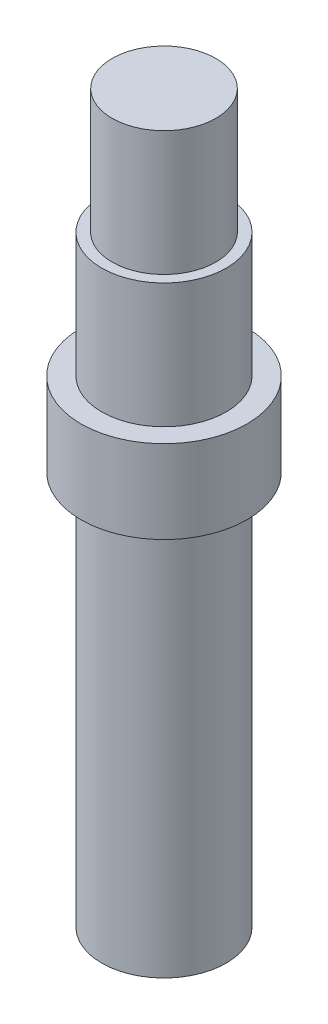
ISO-10303-21;
HEADER;
FILE_DESCRIPTION(('STEP AP214'),'2;1');
FILE_NAME('part.step','',(''),(''),'','','');
FILE_SCHEMA(('AUTOMOTIVE_DESIGN { 1 0 10303 214 1 1 1 1 }'));
ENDSEC;
DATA;
#1=APPLICATION_CONTEXT('core data for automotive mechanical design processes');
#2=APPLICATION_PROTOCOL_DEFINITION('international standard','automotive_design',2000,#1);
#3=PRODUCT_CONTEXT('',#1,'mechanical');
#4=PRODUCT('Part','Part','',(#3));
#5=PRODUCT_RELATED_PRODUCT_CATEGORY('part','',(#4));
#6=PRODUCT_DEFINITION_FORMATION('','',#4);
#7=PRODUCT_DEFINITION_CONTEXT('part definition',#1,'design');
#8=PRODUCT_DEFINITION('design','',#6,#7);
#9=PRODUCT_DEFINITION_SHAPE('','',#8);
#10=(LENGTH_UNIT() NAMED_UNIT(*) SI_UNIT(.MILLI.,.METRE.));
#11=(NAMED_UNIT(*) PLANE_ANGLE_UNIT() SI_UNIT($,.RADIAN.));
#12=(NAMED_UNIT(*) SI_UNIT($,.STERADIAN.) SOLID_ANGLE_UNIT());
#13=UNCERTAINTY_MEASURE_WITH_UNIT(LENGTH_MEASURE(1.E-05),#10,'distance_accuracy_value','');
#14=(GEOMETRIC_REPRESENTATION_CONTEXT(3) GLOBAL_UNCERTAINTY_ASSIGNED_CONTEXT((#13)) GLOBAL_UNIT_ASSIGNED_CONTEXT((#10,
#11,#12)) REPRESENTATION_CONTEXT('',''));
#15=CARTESIAN_POINT('',(0.,0.,0.));
#16=DIRECTION('',(0.,0.,1.));
#17=DIRECTION('',(1.,0.,0.));
#18=AXIS2_PLACEMENT_3D('',#15,#16,#17);
#19=CARTESIAN_POINT('',(0.,38.,0.));
#20=DIRECTION('',(0.,-1.,0.));
#21=DIRECTION('',(0.,0.,-1.));
#22=AXIS2_PLACEMENT_3D('',#19,#20,#21);
#23=CYLINDRICAL_SURFACE('',#22,6.);
#24=CARTESIAN_POINT('',(0.,38.,0.));
#25=DIRECTION('',(0.,1.,0.));
#26=DIRECTION('',(0.,0.,1.));
#27=AXIS2_PLACEMENT_3D('',#24,#25,#26);
#28=CIRCLE('',#27,6.);
#29=CARTESIAN_POINT('',(0.,38.,6.));
#30=VERTEX_POINT('',#29);
#31=EDGE_CURVE('E10',#30,#30,#28,.T.);
#32=ORIENTED_EDGE('',*,*,#31,.F.);
#33=EDGE_LOOP('',(#32));
#34=FACE_BOUND('',#33,.T.);
#35=CARTESIAN_POINT('',(0.,0.,0.));
#36=DIRECTION('',(0.,1.,0.));
#37=DIRECTION('',(0.,0.,1.));
#38=AXIS2_PLACEMENT_3D('',#35,#36,#37);
#39=CIRCLE('',#38,6.);
#40=CARTESIAN_POINT('',(0.,0.,6.));
#41=VERTEX_POINT('',#40);
#42=EDGE_CURVE('E34',#41,#41,#39,.T.);
#43=ORIENTED_EDGE('',*,*,#42,.T.);
#44=EDGE_LOOP('',(#43));
#45=FACE_BOUND('',#44,.T.);
#46=ADVANCED_FACE('F31',(#34,#45),#23,.T.);
#47=CARTESIAN_POINT('',(0.,0.,0.));
#48=DIRECTION('',(0.,1.,0.));
#49=DIRECTION('',(0.,0.,1.));
#50=AXIS2_PLACEMENT_3D('',#47,#48,#49);
#51=PLANE('',#50);
#52=ORIENTED_EDGE('',*,*,#42,.F.);
#53=EDGE_LOOP('',(#52));
#54=FACE_BOUND('',#53,.T.);
#55=ADVANCED_FACE('F91',(#54),#51,.F.);
#56=CARTESIAN_POINT('',(0.,46.,0.));
#57=DIRECTION('',(0.,-1.,0.));
#58=DIRECTION('',(0.,0.,-1.));
#59=AXIS2_PLACEMENT_3D('',#56,#57,#58);
#60=CYLINDRICAL_SURFACE('',#59,8.);
#61=CARTESIAN_POINT('',(0.,46.,0.));
#62=DIRECTION('',(0.,1.,0.));
#63=DIRECTION('',(0.,0.,1.));
#64=AXIS2_PLACEMENT_3D('',#61,#62,#63);
#65=CIRCLE('',#64,8.);
#66=CARTESIAN_POINT('',(0.,46.,8.));
#67=VERTEX_POINT('',#66);
#68=EDGE_CURVE('E41',#67,#67,#65,.T.);
#69=ORIENTED_EDGE('',*,*,#68,.F.);
#70=EDGE_LOOP('',(#69));
#71=FACE_BOUND('',#70,.T.);
#72=CARTESIAN_POINT('',(0.,38.,0.));
#73=DIRECTION('',(0.,1.,0.));
#74=DIRECTION('',(0.,0.,1.));
#75=AXIS2_PLACEMENT_3D('',#72,#73,#74);
#76=CIRCLE('',#75,8.);
#77=CARTESIAN_POINT('',(0.,38.,8.));
#78=VERTEX_POINT('',#77);
#79=EDGE_CURVE('E43',#78,#78,#76,.T.);
#80=ORIENTED_EDGE('',*,*,#79,.T.);
#81=EDGE_LOOP('',(#80));
#82=FACE_BOUND('',#81,.T.);
#83=ADVANCED_FACE('F85',(#71,#82),#60,.T.);
#84=CARTESIAN_POINT('',(0.,46.,0.));
#85=DIRECTION('',(0.,1.,0.));
#86=DIRECTION('',(0.,0.,1.));
#87=AXIS2_PLACEMENT_3D('',#84,#85,#86);
#88=PLANE('',#87);
#89=CARTESIAN_POINT('',(0.,46.,0.));
#90=DIRECTION('',(0.,1.,0.));
#91=DIRECTION('',(0.,0.,1.));
#92=AXIS2_PLACEMENT_3D('',#89,#90,#91);
#93=CIRCLE('',#92,6.);
#94=CARTESIAN_POINT('',(0.,46.,6.));
#95=VERTEX_POINT('',#94);
#96=EDGE_CURVE('E49',#95,#95,#93,.T.);
#97=ORIENTED_EDGE('',*,*,#96,.F.);
#98=EDGE_LOOP('',(#97));
#99=FACE_BOUND('',#98,.T.);
#100=ORIENTED_EDGE('',*,*,#68,.T.);
#101=EDGE_LOOP('',(#100));
#102=FACE_BOUND('',#101,.T.);
#103=ADVANCED_FACE('F82',(#99,#102),#88,.T.);
#104=CARTESIAN_POINT('',(0.,38.,0.));
#105=DIRECTION('',(0.,1.,0.));
#106=DIRECTION('',(0.,0.,1.));
#107=AXIS2_PLACEMENT_3D('',#104,#105,#106);
#108=PLANE('',#107);
#109=ORIENTED_EDGE('',*,*,#31,.T.);
#110=EDGE_LOOP('',(#109));
#111=FACE_BOUND('',#110,.T.);
#112=ORIENTED_EDGE('',*,*,#79,.F.);
#113=EDGE_LOOP('',(#112));
#114=FACE_BOUND('',#113,.T.);
#115=ADVANCED_FACE('F78',(#111,#114),#108,.F.);
#116=CARTESIAN_POINT('',(0.,58.,0.));
#117=DIRECTION('',(0.,-1.,0.));
#118=DIRECTION('',(0.,0.,-1.));
#119=AXIS2_PLACEMENT_3D('',#116,#117,#118);
#120=CYLINDRICAL_SURFACE('',#119,6.);
#121=CARTESIAN_POINT('',(0.,58.,0.));
#122=DIRECTION('',(0.,1.,0.));
#123=DIRECTION('',(0.,0.,1.));
#124=AXIS2_PLACEMENT_3D('',#121,#122,#123);
#125=CIRCLE('',#124,6.);
#126=CARTESIAN_POINT('',(0.,58.,6.));
#127=VERTEX_POINT('',#126);
#128=EDGE_CURVE('E46',#127,#127,#125,.T.);
#129=ORIENTED_EDGE('',*,*,#128,.F.);
#130=EDGE_LOOP('',(#129));
#131=FACE_BOUND('',#130,.T.);
#132=ORIENTED_EDGE('',*,*,#96,.T.);
#133=EDGE_LOOP('',(#132));
#134=FACE_BOUND('',#133,.T.);
#135=ADVANCED_FACE('F72',(#131,#134),#120,.T.);
#136=CARTESIAN_POINT('',(0.,58.,0.));
#137=DIRECTION('',(0.,1.,0.));
#138=DIRECTION('',(0.,0.,1.));
#139=AXIS2_PLACEMENT_3D('',#136,#137,#138);
#140=PLANE('',#139);
#141=CARTESIAN_POINT('',(0.,58.,0.));
#142=DIRECTION('',(0.,1.,0.));
#143=DIRECTION('',(0.,0.,1.));
#144=AXIS2_PLACEMENT_3D('',#141,#142,#143);
#145=CIRCLE('',#144,5.);
#146=CARTESIAN_POINT('',(0.,58.,5.));
#147=VERTEX_POINT('',#146);
#148=EDGE_CURVE('E55',#147,#147,#145,.T.);
#149=ORIENTED_EDGE('',*,*,#148,.F.);
#150=EDGE_LOOP('',(#149));
#151=FACE_BOUND('',#150,.T.);
#152=ORIENTED_EDGE('',*,*,#128,.T.);
#153=EDGE_LOOP('',(#152));
#154=FACE_BOUND('',#153,.T.);
#155=ADVANCED_FACE('F66',(#151,#154),#140,.T.);
#156=CARTESIAN_POINT('',(0.,70.,0.));
#157=DIRECTION('',(0.,-1.,0.));
#158=DIRECTION('',(0.,0.,-1.));
#159=AXIS2_PLACEMENT_3D('',#156,#157,#158);
#160=CYLINDRICAL_SURFACE('',#159,5.);
#161=CARTESIAN_POINT('',(0.,70.,0.));
#162=DIRECTION('',(0.,1.,0.));
#163=DIRECTION('',(0.,0.,1.));
#164=AXIS2_PLACEMENT_3D('',#161,#162,#163);
#165=CIRCLE('',#164,5.);
#166=CARTESIAN_POINT('',(0.,70.,5.));
#167=VERTEX_POINT('',#166);
#168=EDGE_CURVE('E52',#167,#167,#165,.T.);
#169=ORIENTED_EDGE('',*,*,#168,.F.);
#170=EDGE_LOOP('',(#169));
#171=FACE_BOUND('',#170,.T.);
#172=ORIENTED_EDGE('',*,*,#148,.T.);
#173=EDGE_LOOP('',(#172));
#174=FACE_BOUND('',#173,.T.);
#175=ADVANCED_FACE('F63',(#171,#174),#160,.T.);
#176=CARTESIAN_POINT('',(0.,70.,0.));
#177=DIRECTION('',(0.,1.,0.));
#178=DIRECTION('',(0.,0.,1.));
#179=AXIS2_PLACEMENT_3D('',#176,#177,#178);
#180=PLANE('',#179);
#181=ORIENTED_EDGE('',*,*,#168,.T.);
#182=EDGE_LOOP('',(#181));
#183=FACE_BOUND('',#182,.T.);
#184=ADVANCED_FACE('F61',(#183),#180,.T.);
#185=CLOSED_SHELL('',(#46,#55,#83,#103,#115,#135,#155,#175,#184));
#186=MANIFOLD_SOLID_BREP('B2',#185);
#187=ADVANCED_BREP_SHAPE_REPRESENTATION('',(#18,#186),#14);
#188=SHAPE_DEFINITION_REPRESENTATION(#9,#187);
ENDSEC;
END-ISO-10303-21;
